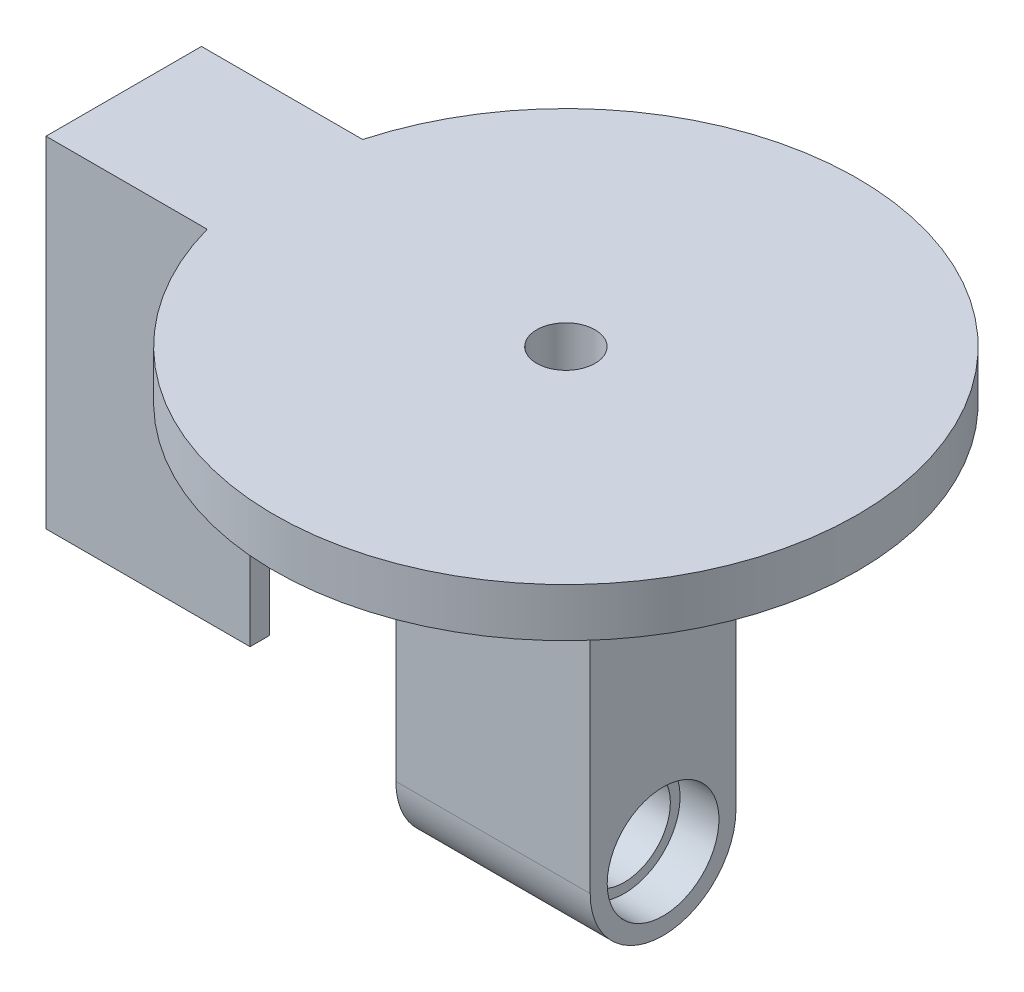
ISO-10303-21;
HEADER;
FILE_DESCRIPTION(('STEP AP214'),'2;1');
FILE_NAME('part.step','',(''),(''),'','','');
FILE_SCHEMA(('AUTOMOTIVE_DESIGN { 1 0 10303 214 1 1 1 1 }'));
ENDSEC;
DATA;
#1=APPLICATION_CONTEXT('core data for automotive mechanical design processes');
#2=APPLICATION_PROTOCOL_DEFINITION('international standard','automotive_design',2000,#1);
#3=PRODUCT_CONTEXT('',#1,'mechanical');
#4=PRODUCT('Part','Part','',(#3));
#5=PRODUCT_RELATED_PRODUCT_CATEGORY('part','',(#4));
#6=PRODUCT_DEFINITION_FORMATION('','',#4);
#7=PRODUCT_DEFINITION_CONTEXT('part definition',#1,'design');
#8=PRODUCT_DEFINITION('design','',#6,#7);
#9=PRODUCT_DEFINITION_SHAPE('','',#8);
#10=(LENGTH_UNIT() NAMED_UNIT(*) SI_UNIT(.MILLI.,.METRE.));
#11=(NAMED_UNIT(*) PLANE_ANGLE_UNIT() SI_UNIT($,.RADIAN.));
#12=(NAMED_UNIT(*) SI_UNIT($,.STERADIAN.) SOLID_ANGLE_UNIT());
#13=UNCERTAINTY_MEASURE_WITH_UNIT(LENGTH_MEASURE(1.E-05),#10,'distance_accuracy_value','');
#14=(GEOMETRIC_REPRESENTATION_CONTEXT(3) GLOBAL_UNCERTAINTY_ASSIGNED_CONTEXT((#13)) GLOBAL_UNIT_ASSIGNED_CONTEXT((#10,
#11,#12)) REPRESENTATION_CONTEXT('',''));
#15=CARTESIAN_POINT('',(0.,0.,0.));
#16=DIRECTION('',(0.,0.,1.));
#17=DIRECTION('',(1.,0.,0.));
#18=AXIS2_PLACEMENT_3D('',#15,#16,#17);
#19=CARTESIAN_POINT('',(0.,-10.,0.));
#20=DIRECTION('',(0.,-1.,0.));
#21=DIRECTION('',(0.,0.,-1.));
#22=AXIS2_PLACEMENT_3D('',#19,#20,#21);
#23=PLANE('',#22);
#24=DIRECTION('',(0.,0.,-1.));
#25=VECTOR('',#24,1.);
#26=CARTESIAN_POINT('',(-45.5,-10.,-8.));
#27=LINE('',#26,#25);
#28=CARTESIAN_POINT('',(-45.5,-10.,6.));
#29=VERTEX_POINT('',#28);
#30=CARTESIAN_POINT('',(-45.5,-10.,-6.));
#31=VERTEX_POINT('',#30);
#32=EDGE_CURVE('E55',#29,#31,#27,.T.);
#33=ORIENTED_EDGE('',*,*,#32,.T.);
#34=DIRECTION('',(-1.,0.,0.));
#35=VECTOR('',#34,1.);
#36=CARTESIAN_POINT('',(-24.5,-10.,-6.));
#37=LINE('',#36,#35);
#38=CARTESIAN_POINT('',(-24.5,-10.,-6.));
#39=VERTEX_POINT('',#38);
#40=EDGE_CURVE('E50',#39,#31,#37,.T.);
#41=ORIENTED_EDGE('',*,*,#40,.F.);
#42=DIRECTION('',(0.,0.,1.));
#43=VECTOR('',#42,1.);
#44=CARTESIAN_POINT('',(-24.5,-10.,-8.));
#45=LINE('',#44,#43);
#46=CARTESIAN_POINT('',(-24.5,-10.,6.));
#47=VERTEX_POINT('',#46);
#48=EDGE_CURVE('E192',#39,#47,#45,.T.);
#49=ORIENTED_EDGE('',*,*,#48,.T.);
#50=DIRECTION('',(1.,0.,0.));
#51=VECTOR('',#50,1.);
#52=CARTESIAN_POINT('',(-24.5,-10.,6.));
#53=LINE('',#52,#51);
#54=EDGE_CURVE('E173',#29,#47,#53,.T.);
#55=ORIENTED_EDGE('',*,*,#54,.F.);
#56=EDGE_LOOP('',(#33,#41,#49,#55));
#57=FACE_BOUND('',#56,.T.);
#58=ADVANCED_FACE('F33',(#57),#23,.T.);
#59=CARTESIAN_POINT('',(0.,0.,0.));
#60=DIRECTION('',(0.,1.,0.));
#61=DIRECTION('',(0.,0.,1.));
#62=AXIS2_PLACEMENT_3D('',#59,#60,#61);
#63=PLANE('',#62);
#64=CARTESIAN_POINT('',(0.,0.,0.));
#65=DIRECTION('',(0.,1.,0.));
#66=DIRECTION('',(0.,0.,1.));
#67=AXIS2_PLACEMENT_3D('',#64,#65,#66);
#68=CIRCLE('',#67,30.);
#69=CARTESIAN_POINT('',(-28.9136645896019,0.,8.));
#70=VERTEX_POINT('',#69);
#71=CARTESIAN_POINT('',(-28.9136645896019,0.,-8.));
#72=VERTEX_POINT('',#71);
#73=EDGE_CURVE('E42',#70,#72,#68,.T.);
#74=ORIENTED_EDGE('',*,*,#73,.F.);
#75=DIRECTION('',(1.,0.,0.));
#76=VECTOR('',#75,1.);
#77=CARTESIAN_POINT('',(0.,0.,8.));
#78=LINE('',#77,#76);
#79=CARTESIAN_POINT('',(-24.5,0.,8.));
#80=VERTEX_POINT('',#79);
#81=EDGE_CURVE('E215',#70,#80,#78,.T.);
#82=ORIENTED_EDGE('',*,*,#81,.T.);
#83=DIRECTION('',(0.,0.,-1.));
#84=VECTOR('',#83,1.);
#85=CARTESIAN_POINT('',(-24.5,0.,0.));
#86=LINE('',#85,#84);
#87=CARTESIAN_POINT('',(-24.5,0.,-8.));
#88=VERTEX_POINT('',#87);
#89=EDGE_CURVE('E206',#80,#88,#86,.T.);
#90=ORIENTED_EDGE('',*,*,#89,.T.);
#91=DIRECTION('',(-1.,0.,0.));
#92=VECTOR('',#91,1.);
#93=CARTESIAN_POINT('',(0.,0.,-8.));
#94=LINE('',#93,#92);
#95=EDGE_CURVE('E141',#88,#72,#94,.T.);
#96=ORIENTED_EDGE('',*,*,#95,.T.);
#97=EDGE_LOOP('',(#74,#82,#90,#96));
#98=FACE_BOUND('',#97,.T.);
#99=DIRECTION('',(0.,0.,1.));
#100=VECTOR('',#99,1.);
#101=CARTESIAN_POINT('',(-10.,0.,7.50000000000001));
#102=LINE('',#101,#100);
#103=CARTESIAN_POINT('',(-10.,0.,-7.49999999999999));
#104=VERTEX_POINT('',#103);
#105=CARTESIAN_POINT('',(-10.,0.,7.50000000000001));
#106=VERTEX_POINT('',#105);
#107=EDGE_CURVE('E224',#104,#106,#102,.T.);
#108=ORIENTED_EDGE('',*,*,#107,.T.);
#109=DIRECTION('',(1.,0.,0.));
#110=VECTOR('',#109,1.);
#111=CARTESIAN_POINT('',(0.,0.,7.50000000000001));
#112=LINE('',#111,#110);
#113=CARTESIAN_POINT('',(10.,0.,7.50000000000001));
#114=VERTEX_POINT('',#113);
#115=EDGE_CURVE('E254',#106,#114,#112,.T.);
#116=ORIENTED_EDGE('',*,*,#115,.T.);
#117=DIRECTION('',(0.,0.,1.));
#118=VECTOR('',#117,1.);
#119=CARTESIAN_POINT('',(10.,0.,7.50000000000001));
#120=LINE('',#119,#118);
#121=CARTESIAN_POINT('',(10.,0.,-7.49999999999999));
#122=VERTEX_POINT('',#121);
#123=EDGE_CURVE('E243',#122,#114,#120,.T.);
#124=ORIENTED_EDGE('',*,*,#123,.F.);
#125=DIRECTION('',(1.,0.,0.));
#126=VECTOR('',#125,1.);
#127=CARTESIAN_POINT('',(0.,0.,-7.49999999999999));
#128=LINE('',#127,#126);
#129=EDGE_CURVE('E255',#104,#122,#128,.T.);
#130=ORIENTED_EDGE('',*,*,#129,.F.);
#131=EDGE_LOOP('',(#108,#116,#124,#130));
#132=FACE_BOUND('',#131,.T.);
#133=ADVANCED_FACE('F288',(#98,#132),#63,.F.);
#134=CARTESIAN_POINT('',(0.,5.,0.));
#135=DIRECTION('',(0.,-1.,0.));
#136=DIRECTION('',(0.,0.,-1.));
#137=AXIS2_PLACEMENT_3D('',#134,#135,#136);
#138=CYLINDRICAL_SURFACE('',#137,30.);
#139=CARTESIAN_POINT('',(0.,5.,0.));
#140=DIRECTION('',(0.,1.,0.));
#141=DIRECTION('',(0.,0.,1.));
#142=AXIS2_PLACEMENT_3D('',#139,#140,#141);
#143=CIRCLE('',#142,30.);
#144=CARTESIAN_POINT('',(-28.9136645896019,5.,8.));
#145=VERTEX_POINT('',#144);
#146=CARTESIAN_POINT('',(-28.9136645896019,5.,-8.));
#147=VERTEX_POINT('',#146);
#148=EDGE_CURVE('E11',#145,#147,#143,.T.);
#149=ORIENTED_EDGE('',*,*,#148,.F.);
#150=DIRECTION('',(0.,-1.,0.));
#151=VECTOR('',#150,1.);
#152=CARTESIAN_POINT('',(-28.9136645896019,5.,8.));
#153=LINE('',#152,#151);
#154=EDGE_CURVE('E212',#145,#70,#153,.T.);
#155=ORIENTED_EDGE('',*,*,#154,.T.);
#156=ORIENTED_EDGE('',*,*,#73,.T.);
#157=DIRECTION('',(0.,-1.,0.));
#158=VECTOR('',#157,1.);
#159=CARTESIAN_POINT('',(-28.9136645896019,5.,-8.));
#160=LINE('',#159,#158);
#161=EDGE_CURVE('E208',#72,#147,#160,.F.);
#162=ORIENTED_EDGE('',*,*,#161,.T.);
#163=EDGE_LOOP('',(#149,#155,#156,#162));
#164=FACE_BOUND('',#163,.T.);
#165=ADVANCED_FACE('F35',(#164),#138,.T.);
#166=CARTESIAN_POINT('',(0.,5.,0.));
#167=DIRECTION('',(0.,1.,0.));
#168=DIRECTION('',(0.,0.,1.));
#169=AXIS2_PLACEMENT_3D('',#166,#167,#168);
#170=PLANE('',#169);
#171=CARTESIAN_POINT('',(0.,5.,0.));
#172=DIRECTION('',(0.,1.,0.));
#173=DIRECTION('',(0.,0.,1.));
#174=AXIS2_PLACEMENT_3D('',#171,#172,#173);
#175=CIRCLE('',#174,3.);
#176=CARTESIAN_POINT('',(0.,5.,3.));
#177=VERTEX_POINT('',#176);
#178=EDGE_CURVE('E164',#177,#177,#175,.T.);
#179=ORIENTED_EDGE('',*,*,#178,.F.);
#180=EDGE_LOOP('',(#179));
#181=FACE_BOUND('',#180,.T.);
#182=ORIENTED_EDGE('',*,*,#148,.T.);
#183=DIRECTION('',(1.,0.,0.));
#184=VECTOR('',#183,1.);
#185=CARTESIAN_POINT('',(-24.5,5.,-8.));
#186=LINE('',#185,#184);
#187=CARTESIAN_POINT('',(-45.5,5.,-8.));
#188=VERTEX_POINT('',#187);
#189=EDGE_CURVE('E145',#188,#147,#186,.T.);
#190=ORIENTED_EDGE('',*,*,#189,.F.);
#191=DIRECTION('',(0.,0.,-1.));
#192=VECTOR('',#191,1.);
#193=CARTESIAN_POINT('',(-45.5,5.,-8.));
#194=LINE('',#193,#192);
#195=CARTESIAN_POINT('',(-45.5,5.,8.));
#196=VERTEX_POINT('',#195);
#197=EDGE_CURVE('E200',#196,#188,#194,.T.);
#198=ORIENTED_EDGE('',*,*,#197,.F.);
#199=DIRECTION('',(-1.,0.,0.));
#200=VECTOR('',#199,1.);
#201=CARTESIAN_POINT('',(-24.5,5.,8.));
#202=LINE('',#201,#200);
#203=EDGE_CURVE('E195',#145,#196,#202,.T.);
#204=ORIENTED_EDGE('',*,*,#203,.F.);
#205=EDGE_LOOP('',(#182,#190,#198,#204));
#206=FACE_BOUND('',#205,.T.);
#207=ADVANCED_FACE('F348',(#181,#206),#170,.T.);
#208=CARTESIAN_POINT('',(0.,0.,-7.49999999999999));
#209=DIRECTION('',(0.,0.,-1.));
#210=DIRECTION('',(-1.,0.,0.));
#211=AXIS2_PLACEMENT_3D('',#208,#209,#210);
#212=PLANE('',#211);
#213=DIRECTION('',(0.,1.,0.));
#214=VECTOR('',#213,1.);
#215=CARTESIAN_POINT('',(10.,0.,-7.49999999999999));
#216=LINE('',#215,#214);
#217=CARTESIAN_POINT('',(10.,-35.,-7.49999999999999));
#218=VERTEX_POINT('',#217);
#219=EDGE_CURVE('E252',#218,#122,#216,.T.);
#220=ORIENTED_EDGE('',*,*,#219,.F.);
#221=DIRECTION('',(1.,0.,0.));
#222=VECTOR('',#221,1.);
#223=CARTESIAN_POINT('',(0.,-35.,-7.49999999999999));
#224=LINE('',#223,#222);
#225=CARTESIAN_POINT('',(-10.,-35.,-7.49999999999999));
#226=VERTEX_POINT('',#225);
#227=EDGE_CURVE('E258',#226,#218,#224,.T.);
#228=ORIENTED_EDGE('',*,*,#227,.F.);
#229=DIRECTION('',(0.,1.,0.));
#230=VECTOR('',#229,1.);
#231=CARTESIAN_POINT('',(-10.,0.,-7.49999999999999));
#232=LINE('',#231,#230);
#233=EDGE_CURVE('E227',#226,#104,#232,.T.);
#234=ORIENTED_EDGE('',*,*,#233,.T.);
#235=ORIENTED_EDGE('',*,*,#129,.T.);
#236=EDGE_LOOP('',(#220,#228,#234,#235));
#237=FACE_BOUND('',#236,.T.);
#238=ADVANCED_FACE('F331',(#237),#212,.T.);
#239=CARTESIAN_POINT('',(0.,-35.,0.));
#240=DIRECTION('',(1.,0.,0.));
#241=DIRECTION('',(0.,0.,-1.));
#242=AXIS2_PLACEMENT_3D('',#239,#240,#241);
#243=CYLINDRICAL_SURFACE('',#242,7.5);
#244=CARTESIAN_POINT('',(10.,-35.,0.));
#245=DIRECTION('',(1.,0.,0.));
#246=DIRECTION('',(0.,0.,-1.));
#247=AXIS2_PLACEMENT_3D('',#244,#245,#246);
#248=CIRCLE('',#247,7.5);
#249=CARTESIAN_POINT('',(10.,-35.,7.50000000000001));
#250=VERTEX_POINT('',#249);
#251=EDGE_CURVE('E249',#250,#218,#248,.T.);
#252=ORIENTED_EDGE('',*,*,#251,.F.);
#253=DIRECTION('',(1.,0.,0.));
#254=VECTOR('',#253,1.);
#255=CARTESIAN_POINT('',(0.,-35.,7.50000000000001));
#256=LINE('',#255,#254);
#257=CARTESIAN_POINT('',(-10.,-35.,7.50000000000001));
#258=VERTEX_POINT('',#257);
#259=EDGE_CURVE('E260',#258,#250,#256,.T.);
#260=ORIENTED_EDGE('',*,*,#259,.F.);
#261=CARTESIAN_POINT('',(-10.,-35.,0.));
#262=DIRECTION('',(1.,0.,0.));
#263=DIRECTION('',(0.,0.,-1.));
#264=AXIS2_PLACEMENT_3D('',#261,#262,#263);
#265=CIRCLE('',#264,7.5);
#266=EDGE_CURVE('E230',#258,#226,#265,.T.);
#267=ORIENTED_EDGE('',*,*,#266,.T.);
#268=ORIENTED_EDGE('',*,*,#227,.T.);
#269=EDGE_LOOP('',(#252,#260,#267,#268));
#270=FACE_BOUND('',#269,.T.);
#271=ADVANCED_FACE('F334',(#270),#243,.T.);
#272=CARTESIAN_POINT('',(0.,0.,7.50000000000001));
#273=DIRECTION('',(0.,0.,1.));
#274=DIRECTION('',(1.,0.,0.));
#275=AXIS2_PLACEMENT_3D('',#272,#273,#274);
#276=PLANE('',#275);
#277=DIRECTION('',(0.,-1.,0.));
#278=VECTOR('',#277,1.);
#279=CARTESIAN_POINT('',(10.,0.,7.50000000000001));
#280=LINE('',#279,#278);
#281=EDGE_CURVE('E246',#114,#250,#280,.T.);
#282=ORIENTED_EDGE('',*,*,#281,.F.);
#283=ORIENTED_EDGE('',*,*,#115,.F.);
#284=DIRECTION('',(0.,-1.,0.));
#285=VECTOR('',#284,1.);
#286=CARTESIAN_POINT('',(-10.,0.,7.50000000000001));
#287=LINE('',#286,#285);
#288=EDGE_CURVE('E233',#106,#258,#287,.T.);
#289=ORIENTED_EDGE('',*,*,#288,.T.);
#290=ORIENTED_EDGE('',*,*,#259,.T.);
#291=EDGE_LOOP('',(#282,#283,#289,#290));
#292=FACE_BOUND('',#291,.T.);
#293=ADVANCED_FACE('F336',(#292),#276,.T.);
#294=CARTESIAN_POINT('',(10.,-35.,0.));
#295=DIRECTION('',(1.,0.,0.));
#296=DIRECTION('',(0.,0.,-1.));
#297=AXIS2_PLACEMENT_3D('',#294,#295,#296);
#298=PLANE('',#297);
#299=CARTESIAN_POINT('',(10.,-35.,0.));
#300=DIRECTION('',(-1.,0.,0.));
#301=DIRECTION('',(0.,0.,1.));
#302=AXIS2_PLACEMENT_3D('',#299,#300,#301);
#303=CIRCLE('',#302,5.74999999999999);
#304=CARTESIAN_POINT('',(10.,-35.,5.75));
#305=VERTEX_POINT('',#304);
#306=EDGE_CURVE('E236',#305,#305,#303,.T.);
#307=ORIENTED_EDGE('',*,*,#306,.T.);
#308=EDGE_LOOP('',(#307));
#309=FACE_BOUND('',#308,.T.);
#310=ORIENTED_EDGE('',*,*,#123,.T.);
#311=ORIENTED_EDGE('',*,*,#281,.T.);
#312=ORIENTED_EDGE('',*,*,#251,.T.);
#313=ORIENTED_EDGE('',*,*,#219,.T.);
#314=EDGE_LOOP('',(#310,#311,#312,#313));
#315=FACE_BOUND('',#314,.T.);
#316=ADVANCED_FACE('F282',(#309,#315),#298,.T.);
#317=CARTESIAN_POINT('',(0.,-35.,0.));
#318=DIRECTION('',(1.,0.,0.));
#319=DIRECTION('',(0.,0.,-1.));
#320=AXIS2_PLACEMENT_3D('',#317,#318,#319);
#321=CYLINDRICAL_SURFACE('',#320,4.75000000000001);
#322=CARTESIAN_POINT('',(-6.,-35.,0.));
#323=DIRECTION('',(1.,0.,0.));
#324=DIRECTION('',(0.,0.,-1.));
#325=AXIS2_PLACEMENT_3D('',#322,#323,#324);
#326=CIRCLE('',#325,4.75000000000001);
#327=CARTESIAN_POINT('',(-6.,-35.,-4.75));
#328=VERTEX_POINT('',#327);
#329=EDGE_CURVE('E37',#328,#328,#326,.F.);
#330=ORIENTED_EDGE('',*,*,#329,.T.);
#331=EDGE_LOOP('',(#330));
#332=FACE_BOUND('',#331,.T.);
#333=CARTESIAN_POINT('',(6.,-35.,0.));
#334=DIRECTION('',(-1.,0.,0.));
#335=DIRECTION('',(0.,0.,1.));
#336=AXIS2_PLACEMENT_3D('',#333,#334,#335);
#337=CIRCLE('',#336,4.75000000000001);
#338=CARTESIAN_POINT('',(6.,-35.,4.75000000000001));
#339=VERTEX_POINT('',#338);
#340=EDGE_CURVE('E240',#339,#339,#337,.F.);
#341=ORIENTED_EDGE('',*,*,#340,.T.);
#342=EDGE_LOOP('',(#341));
#343=FACE_BOUND('',#342,.T.);
#344=ADVANCED_FACE('F268',(#332,#343),#321,.F.);
#345=CARTESIAN_POINT('',(6.,-35.,0.));
#346=DIRECTION('',(-1.,0.,0.));
#347=DIRECTION('',(0.,0.,1.));
#348=AXIS2_PLACEMENT_3D('',#345,#346,#347);
#349=PLANE('',#348);
#350=CARTESIAN_POINT('',(6.,-35.,0.));
#351=DIRECTION('',(-1.,0.,0.));
#352=DIRECTION('',(0.,0.,1.));
#353=AXIS2_PLACEMENT_3D('',#350,#351,#352);
#354=CIRCLE('',#353,5.74999999999999);
#355=CARTESIAN_POINT('',(6.,-35.,5.75));
#356=VERTEX_POINT('',#355);
#357=EDGE_CURVE('E237',#356,#356,#354,.T.);
#358=ORIENTED_EDGE('',*,*,#357,.F.);
#359=EDGE_LOOP('',(#358));
#360=FACE_BOUND('',#359,.T.);
#361=ORIENTED_EDGE('',*,*,#340,.F.);
#362=EDGE_LOOP('',(#361));
#363=FACE_BOUND('',#362,.T.);
#364=ADVANCED_FACE('F270',(#360,#363),#349,.F.);
#365=CARTESIAN_POINT('',(6.,-35.,0.));
#366=DIRECTION('',(1.,0.,0.));
#367=DIRECTION('',(0.,0.,-1.));
#368=AXIS2_PLACEMENT_3D('',#365,#366,#367);
#369=CYLINDRICAL_SURFACE('',#368,5.74999999999999);
#370=ORIENTED_EDGE('',*,*,#357,.T.);
#371=EDGE_LOOP('',(#370));
#372=FACE_BOUND('',#371,.T.);
#373=ORIENTED_EDGE('',*,*,#306,.F.);
#374=EDGE_LOOP('',(#373));
#375=FACE_BOUND('',#374,.T.);
#376=ADVANCED_FACE('F272',(#372,#375),#369,.F.);
#377=CARTESIAN_POINT('',(-10.,-35.,0.));
#378=DIRECTION('',(-1.,0.,0.));
#379=DIRECTION('',(0.,0.,-1.));
#380=AXIS2_PLACEMENT_3D('',#377,#378,#379);
#381=PLANE('',#380);
#382=CARTESIAN_POINT('',(-10.,-35.,0.));
#383=DIRECTION('',(-1.,0.,0.));
#384=DIRECTION('',(0.,0.,1.));
#385=AXIS2_PLACEMENT_3D('',#382,#383,#384);
#386=CIRCLE('',#385,5.74999999999999);
#387=CARTESIAN_POINT('',(-10.,-35.,5.75));
#388=VERTEX_POINT('',#387);
#389=EDGE_CURVE('E218',#388,#388,#386,.T.);
#390=ORIENTED_EDGE('',*,*,#389,.F.);
#391=EDGE_LOOP('',(#390));
#392=FACE_BOUND('',#391,.T.);
#393=ORIENTED_EDGE('',*,*,#107,.F.);
#394=ORIENTED_EDGE('',*,*,#233,.F.);
#395=ORIENTED_EDGE('',*,*,#266,.F.);
#396=ORIENTED_EDGE('',*,*,#288,.F.);
#397=EDGE_LOOP('',(#393,#394,#395,#396));
#398=FACE_BOUND('',#397,.T.);
#399=ADVANCED_FACE('F279',(#392,#398),#381,.T.);
#400=CARTESIAN_POINT('',(-6.,-35.,0.));
#401=DIRECTION('',(1.,0.,0.));
#402=DIRECTION('',(0.,0.,1.));
#403=AXIS2_PLACEMENT_3D('',#400,#401,#402);
#404=PLANE('',#403);
#405=CARTESIAN_POINT('',(-6.,-35.,0.));
#406=DIRECTION('',(-1.,0.,0.));
#407=DIRECTION('',(0.,0.,1.));
#408=AXIS2_PLACEMENT_3D('',#405,#406,#407);
#409=CIRCLE('',#408,5.74999999999999);
#410=CARTESIAN_POINT('',(-6.,-35.,5.75));
#411=VERTEX_POINT('',#410);
#412=EDGE_CURVE('E219',#411,#411,#409,.T.);
#413=ORIENTED_EDGE('',*,*,#412,.T.);
#414=EDGE_LOOP('',(#413));
#415=FACE_BOUND('',#414,.T.);
#416=ORIENTED_EDGE('',*,*,#329,.F.);
#417=EDGE_LOOP('',(#416));
#418=FACE_BOUND('',#417,.T.);
#419=ADVANCED_FACE('F311',(#415,#418),#404,.F.);
#420=CARTESIAN_POINT('',(-6.,-35.,0.));
#421=DIRECTION('',(-1.,0.,0.));
#422=DIRECTION('',(0.,0.,1.));
#423=AXIS2_PLACEMENT_3D('',#420,#421,#422);
#424=CYLINDRICAL_SURFACE('',#423,5.74999999999999);
#425=ORIENTED_EDGE('',*,*,#412,.F.);
#426=EDGE_LOOP('',(#425));
#427=FACE_BOUND('',#426,.T.);
#428=ORIENTED_EDGE('',*,*,#389,.T.);
#429=EDGE_LOOP('',(#428));
#430=FACE_BOUND('',#429,.T.);
#431=ADVANCED_FACE('F309',(#427,#430),#424,.F.);
#432=CARTESIAN_POINT('',(-24.5,31.4007575648882,8.));
#433=DIRECTION('',(0.,0.,1.));
#434=DIRECTION('',(1.,0.,0.));
#435=AXIS2_PLACEMENT_3D('',#432,#433,#434);
#436=PLANE('',#435);
#437=ORIENTED_EDGE('',*,*,#81,.F.);
#438=ORIENTED_EDGE('',*,*,#154,.F.);
#439=ORIENTED_EDGE('',*,*,#203,.T.);
#440=DIRECTION('',(0.,-1.,0.));
#441=VECTOR('',#440,1.);
#442=CARTESIAN_POINT('',(-45.5,31.4007575648882,8.));
#443=LINE('',#442,#441);
#444=CARTESIAN_POINT('',(-45.5,-30.,8.));
#445=VERTEX_POINT('',#444);
#446=EDGE_CURVE('E197',#196,#445,#443,.T.);
#447=ORIENTED_EDGE('',*,*,#446,.T.);
#448=DIRECTION('',(-1.,0.,0.));
#449=VECTOR('',#448,1.);
#450=CARTESIAN_POINT('',(-45.5,-30.,8.));
#451=LINE('',#450,#449);
#452=CARTESIAN_POINT('',(-24.5,-30.,8.));
#453=VERTEX_POINT('',#452);
#454=EDGE_CURVE('E174',#453,#445,#451,.T.);
#455=ORIENTED_EDGE('',*,*,#454,.F.);
#456=DIRECTION('',(0.,-1.,0.));
#457=VECTOR('',#456,1.);
#458=CARTESIAN_POINT('',(-24.5,31.4007575648882,8.));
#459=LINE('',#458,#457);
#460=EDGE_CURVE('E144',#80,#453,#459,.T.);
#461=ORIENTED_EDGE('',*,*,#460,.F.);
#462=EDGE_LOOP('',(#437,#438,#439,#447,#455,#461));
#463=FACE_BOUND('',#462,.T.);
#464=ADVANCED_FACE('F303',(#463),#436,.T.);
#465=CARTESIAN_POINT('',(-24.5,31.4007575648882,-8.));
#466=DIRECTION('',(0.,0.,-1.));
#467=DIRECTION('',(-1.,0.,0.));
#468=AXIS2_PLACEMENT_3D('',#465,#466,#467);
#469=PLANE('',#468);
#470=ORIENTED_EDGE('',*,*,#95,.F.);
#471=DIRECTION('',(0.,-1.,0.));
#472=VECTOR('',#471,1.);
#473=CARTESIAN_POINT('',(-24.5,31.4007575648882,-8.));
#474=LINE('',#473,#472);
#475=CARTESIAN_POINT('',(-24.5,-30.,-8.));
#476=VERTEX_POINT('',#475);
#477=EDGE_CURVE('E134',#88,#476,#474,.T.);
#478=ORIENTED_EDGE('',*,*,#477,.T.);
#479=DIRECTION('',(1.,0.,0.));
#480=VECTOR('',#479,1.);
#481=CARTESIAN_POINT('',(-45.5,-30.,-8.));
#482=LINE('',#481,#480);
#483=CARTESIAN_POINT('',(-45.5,-30.,-8.));
#484=VERTEX_POINT('',#483);
#485=EDGE_CURVE('E139',#484,#476,#482,.T.);
#486=ORIENTED_EDGE('',*,*,#485,.F.);
#487=DIRECTION('',(0.,-1.,0.));
#488=VECTOR('',#487,1.);
#489=CARTESIAN_POINT('',(-45.5,31.4007575648882,-8.));
#490=LINE('',#489,#488);
#491=EDGE_CURVE('E199',#188,#484,#490,.T.);
#492=ORIENTED_EDGE('',*,*,#491,.F.);
#493=ORIENTED_EDGE('',*,*,#189,.T.);
#494=ORIENTED_EDGE('',*,*,#161,.F.);
#495=EDGE_LOOP('',(#470,#478,#486,#492,#493,#494));
#496=FACE_BOUND('',#495,.T.);
#497=ADVANCED_FACE('F136',(#496),#469,.T.);
#498=CARTESIAN_POINT('',(-24.5,31.4007575648882,-8.));
#499=DIRECTION('',(1.,0.,0.));
#500=DIRECTION('',(0.,0.,-1.));
#501=AXIS2_PLACEMENT_3D('',#498,#499,#500);
#502=PLANE('',#501);
#503=ORIENTED_EDGE('',*,*,#89,.F.);
#504=ORIENTED_EDGE('',*,*,#460,.T.);
#505=DIRECTION('',(0.,0.,1.));
#506=VECTOR('',#505,1.);
#507=CARTESIAN_POINT('',(-24.5,-30.,8.));
#508=LINE('',#507,#506);
#509=CARTESIAN_POINT('',(-24.5,-30.,6.));
#510=VERTEX_POINT('',#509);
#511=EDGE_CURVE('E181',#510,#453,#508,.T.);
#512=ORIENTED_EDGE('',*,*,#511,.F.);
#513=DIRECTION('',(0.,1.,0.));
#514=VECTOR('',#513,1.);
#515=CARTESIAN_POINT('',(-24.5,-30.,6.));
#516=LINE('',#515,#514);
#517=EDGE_CURVE('E184',#510,#47,#516,.T.);
#518=ORIENTED_EDGE('',*,*,#517,.T.);
#519=ORIENTED_EDGE('',*,*,#48,.F.);
#520=DIRECTION('',(0.,1.,0.));
#521=VECTOR('',#520,1.);
#522=CARTESIAN_POINT('',(-24.5,-30.,-6.));
#523=LINE('',#522,#521);
#524=CARTESIAN_POINT('',(-24.5,-30.,-6.));
#525=VERTEX_POINT('',#524);
#526=EDGE_CURVE('E151',#525,#39,#523,.T.);
#527=ORIENTED_EDGE('',*,*,#526,.F.);
#528=DIRECTION('',(0.,0.,1.));
#529=VECTOR('',#528,1.);
#530=CARTESIAN_POINT('',(-24.5,-30.,-8.));
#531=LINE('',#530,#529);
#532=EDGE_CURVE('E148',#476,#525,#531,.T.);
#533=ORIENTED_EDGE('',*,*,#532,.F.);
#534=ORIENTED_EDGE('',*,*,#477,.F.);
#535=EDGE_LOOP('',(#503,#504,#512,#518,#519,#527,#533,#534));
#536=FACE_BOUND('',#535,.T.);
#537=ADVANCED_FACE('F149',(#536),#502,.T.);
#538=CARTESIAN_POINT('',(-45.5,31.4007575648882,-8.));
#539=DIRECTION('',(-1.,0.,0.));
#540=DIRECTION('',(0.,0.,1.));
#541=AXIS2_PLACEMENT_3D('',#538,#539,#540);
#542=PLANE('',#541);
#543=ORIENTED_EDGE('',*,*,#446,.F.);
#544=ORIENTED_EDGE('',*,*,#197,.T.);
#545=ORIENTED_EDGE('',*,*,#491,.T.);
#546=DIRECTION('',(0.,0.,-1.));
#547=VECTOR('',#546,1.);
#548=CARTESIAN_POINT('',(-45.5,-30.,-6.));
#549=LINE('',#548,#547);
#550=CARTESIAN_POINT('',(-45.5,-30.,-6.));
#551=VERTEX_POINT('',#550);
#552=EDGE_CURVE('E159',#551,#484,#549,.T.);
#553=ORIENTED_EDGE('',*,*,#552,.F.);
#554=DIRECTION('',(0.,1.,0.));
#555=VECTOR('',#554,1.);
#556=CARTESIAN_POINT('',(-45.5,-30.,-6.));
#557=LINE('',#556,#555);
#558=EDGE_CURVE('E168',#551,#31,#557,.T.);
#559=ORIENTED_EDGE('',*,*,#558,.T.);
#560=ORIENTED_EDGE('',*,*,#32,.F.);
#561=DIRECTION('',(0.,1.,0.));
#562=VECTOR('',#561,1.);
#563=CARTESIAN_POINT('',(-45.5,-30.,6.));
#564=LINE('',#563,#562);
#565=CARTESIAN_POINT('',(-45.5,-30.,6.));
#566=VERTEX_POINT('',#565);
#567=EDGE_CURVE('E189',#566,#29,#564,.T.);
#568=ORIENTED_EDGE('',*,*,#567,.F.);
#569=DIRECTION('',(0.,0.,-1.));
#570=VECTOR('',#569,1.);
#571=CARTESIAN_POINT('',(-45.5,-30.,6.));
#572=LINE('',#571,#570);
#573=EDGE_CURVE('E177',#445,#566,#572,.T.);
#574=ORIENTED_EDGE('',*,*,#573,.F.);
#575=EDGE_LOOP('',(#543,#544,#545,#553,#559,#560,#568,#574));
#576=FACE_BOUND('',#575,.T.);
#577=ADVANCED_FACE('F300',(#576),#542,.T.);
#578=CARTESIAN_POINT('',(-24.5,-30.,6.));
#579=DIRECTION('',(0.,0.,1.));
#580=DIRECTION('',(1.,0.,0.));
#581=AXIS2_PLACEMENT_3D('',#578,#579,#580);
#582=PLANE('',#581);
#583=ORIENTED_EDGE('',*,*,#54,.T.);
#584=ORIENTED_EDGE('',*,*,#517,.F.);
#585=DIRECTION('',(1.,0.,0.));
#586=VECTOR('',#585,1.);
#587=CARTESIAN_POINT('',(-24.5,-30.,6.));
#588=LINE('',#587,#586);
#589=EDGE_CURVE('E179',#566,#510,#588,.T.);
#590=ORIENTED_EDGE('',*,*,#589,.F.);
#591=ORIENTED_EDGE('',*,*,#567,.T.);
#592=EDGE_LOOP('',(#583,#584,#590,#591));
#593=FACE_BOUND('',#592,.T.);
#594=ADVANCED_FACE('F296',(#593),#582,.F.);
#595=CARTESIAN_POINT('',(0.,-30.,0.));
#596=DIRECTION('',(0.,1.,0.));
#597=DIRECTION('',(0.,0.,1.));
#598=AXIS2_PLACEMENT_3D('',#595,#596,#597);
#599=PLANE('',#598);
#600=ORIENTED_EDGE('',*,*,#454,.T.);
#601=ORIENTED_EDGE('',*,*,#573,.T.);
#602=ORIENTED_EDGE('',*,*,#589,.T.);
#603=ORIENTED_EDGE('',*,*,#511,.T.);
#604=EDGE_LOOP('',(#600,#601,#602,#603));
#605=FACE_BOUND('',#604,.T.);
#606=ADVANCED_FACE('F370',(#605),#599,.F.);
#607=CARTESIAN_POINT('',(-24.5,-30.,-6.));
#608=DIRECTION('',(0.,0.,-1.));
#609=DIRECTION('',(-1.,0.,0.));
#610=AXIS2_PLACEMENT_3D('',#607,#608,#609);
#611=PLANE('',#610);
#612=ORIENTED_EDGE('',*,*,#40,.T.);
#613=ORIENTED_EDGE('',*,*,#558,.F.);
#614=DIRECTION('',(-1.,0.,0.));
#615=VECTOR('',#614,1.);
#616=CARTESIAN_POINT('',(-24.5,-30.,-6.));
#617=LINE('',#616,#615);
#618=EDGE_CURVE('E154',#525,#551,#617,.T.);
#619=ORIENTED_EDGE('',*,*,#618,.F.);
#620=ORIENTED_EDGE('',*,*,#526,.T.);
#621=EDGE_LOOP('',(#612,#613,#619,#620));
#622=FACE_BOUND('',#621,.T.);
#623=ADVANCED_FACE('F377',(#622),#611,.F.);
#624=CARTESIAN_POINT('',(0.,-30.,0.));
#625=DIRECTION('',(0.,-1.,0.));
#626=DIRECTION('',(0.,0.,-1.));
#627=AXIS2_PLACEMENT_3D('',#624,#625,#626);
#628=PLANE('',#627);
#629=ORIENTED_EDGE('',*,*,#485,.T.);
#630=ORIENTED_EDGE('',*,*,#532,.T.);
#631=ORIENTED_EDGE('',*,*,#618,.T.);
#632=ORIENTED_EDGE('',*,*,#552,.T.);
#633=EDGE_LOOP('',(#629,#630,#631,#632));
#634=FACE_BOUND('',#633,.T.);
#635=ADVANCED_FACE('F157',(#634),#628,.T.);
#636=CARTESIAN_POINT('',(0.,-3.,0.));
#637=DIRECTION('',(0.,1.,0.));
#638=DIRECTION('',(0.,0.,1.));
#639=AXIS2_PLACEMENT_3D('',#636,#637,#638);
#640=CYLINDRICAL_SURFACE('',#639,3.);
#641=CARTESIAN_POINT('',(0.,-3.,0.));
#642=DIRECTION('',(0.,1.,0.));
#643=DIRECTION('',(0.,0.,1.));
#644=AXIS2_PLACEMENT_3D('',#641,#642,#643);
#645=CIRCLE('',#644,3.);
#646=CARTESIAN_POINT('',(0.,-3.,3.));
#647=VERTEX_POINT('',#646);
#648=EDGE_CURVE('E161',#647,#647,#645,.T.);
#649=ORIENTED_EDGE('',*,*,#648,.F.);
#650=EDGE_LOOP('',(#649));
#651=FACE_BOUND('',#650,.T.);
#652=ORIENTED_EDGE('',*,*,#178,.T.);
#653=EDGE_LOOP('',(#652));
#654=FACE_BOUND('',#653,.T.);
#655=ADVANCED_FACE('F384',(#651,#654),#640,.F.);
#656=CARTESIAN_POINT('',(0.,-3.,0.));
#657=DIRECTION('',(0.,1.,0.));
#658=DIRECTION('',(0.,0.,1.));
#659=AXIS2_PLACEMENT_3D('',#656,#657,#658);
#660=PLANE('',#659);
#661=ORIENTED_EDGE('',*,*,#648,.T.);
#662=EDGE_LOOP('',(#661));
#663=FACE_BOUND('',#662,.T.);
#664=ADVANCED_FACE('F389',(#663),#660,.T.);
#665=CLOSED_SHELL('',(#58,#133,#165,#207,#238,#271,#293,#316,#344,#364,#376,#399,#419,#431,#464,
#497,#537,#577,#594,#606,#623,#635,#655,#664));
#666=MANIFOLD_SOLID_BREP('B2',#665);
#667=ADVANCED_BREP_SHAPE_REPRESENTATION('',(#18,#666),#14);
#668=SHAPE_DEFINITION_REPRESENTATION(#9,#667);
ENDSEC;
END-ISO-10303-21;
